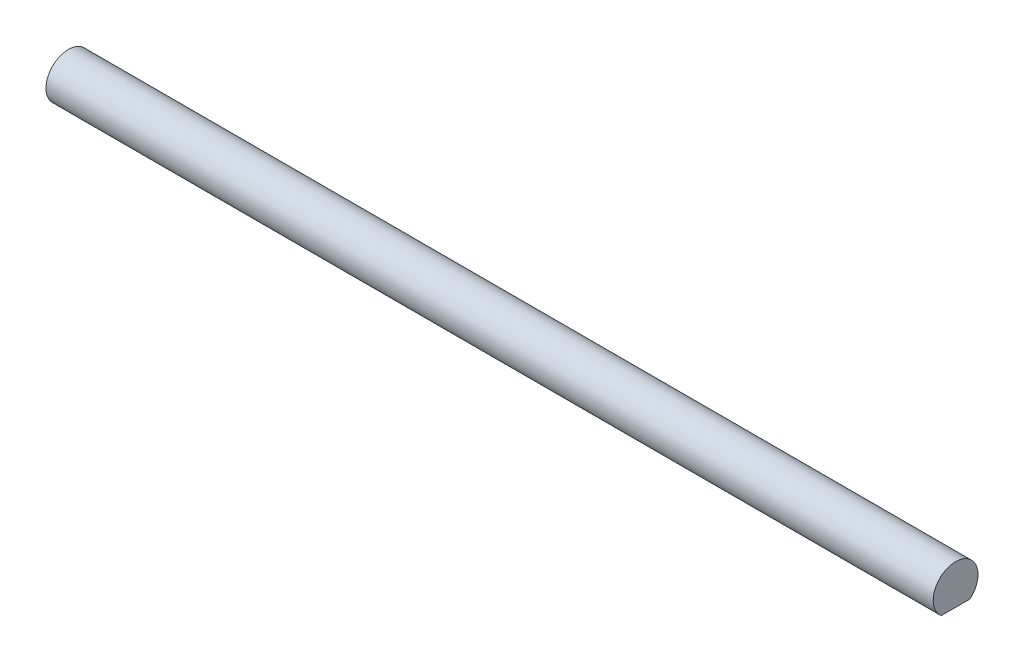
ISO-10303-21;
HEADER;
FILE_DESCRIPTION(('STEP AP214'),'2;1');
FILE_NAME('part.step','',(''),(''),'','','');
FILE_SCHEMA(('AUTOMOTIVE_DESIGN { 1 0 10303 214 1 1 1 1 }'));
ENDSEC;
DATA;
#1=APPLICATION_CONTEXT('core data for automotive mechanical design processes');
#2=APPLICATION_PROTOCOL_DEFINITION('international standard','automotive_design',2000,#1);
#3=PRODUCT_CONTEXT('',#1,'mechanical');
#4=PRODUCT('Part','Part','',(#3));
#5=PRODUCT_RELATED_PRODUCT_CATEGORY('part','',(#4));
#6=PRODUCT_DEFINITION_FORMATION('','',#4);
#7=PRODUCT_DEFINITION_CONTEXT('part definition',#1,'design');
#8=PRODUCT_DEFINITION('design','',#6,#7);
#9=PRODUCT_DEFINITION_SHAPE('','',#8);
#10=(LENGTH_UNIT() NAMED_UNIT(*) SI_UNIT(.MILLI.,.METRE.));
#11=(NAMED_UNIT(*) PLANE_ANGLE_UNIT() SI_UNIT($,.RADIAN.));
#12=(NAMED_UNIT(*) SI_UNIT($,.STERADIAN.) SOLID_ANGLE_UNIT());
#13=UNCERTAINTY_MEASURE_WITH_UNIT(LENGTH_MEASURE(1.E-05),#10,'distance_accuracy_value','');
#14=(GEOMETRIC_REPRESENTATION_CONTEXT(3) GLOBAL_UNCERTAINTY_ASSIGNED_CONTEXT((#13)) GLOBAL_UNIT_ASSIGNED_CONTEXT((#10,
#11,#12)) REPRESENTATION_CONTEXT('',''));
#15=CARTESIAN_POINT('',(0.,0.,0.));
#16=DIRECTION('',(0.,0.,1.));
#17=DIRECTION('',(1.,0.,0.));
#18=AXIS2_PLACEMENT_3D('',#15,#16,#17);
#19=CARTESIAN_POINT('',(304.8,-2.43959033446192,0.));
#20=DIRECTION('',(0.,1.,0.));
#21=DIRECTION('',(0.,0.,1.));
#22=AXIS2_PLACEMENT_3D('',#19,#20,#21);
#23=PLANE('',#22);
#24=DIRECTION('',(0.,0.,-1.));
#25=VECTOR('',#24,1.);
#26=CARTESIAN_POINT('',(125.73,-2.43959033446192,0.));
#27=LINE('',#26,#25);
#28=CARTESIAN_POINT('',(125.73,-2.43959033446192,2.032));
#29=VERTEX_POINT('',#28);
#30=CARTESIAN_POINT('',(125.73,-2.43959033446192,-2.032));
#31=VERTEX_POINT('',#30);
#32=EDGE_CURVE('E55',#29,#31,#27,.T.);
#33=ORIENTED_EDGE('',*,*,#32,.F.);
#34=DIRECTION('',(-1.,0.,0.));
#35=VECTOR('',#34,1.);
#36=CARTESIAN_POINT('',(304.8,-2.43959033446192,2.032));
#37=LINE('',#36,#35);
#38=CARTESIAN_POINT('',(0.,-2.43959033446192,2.032));
#39=VERTEX_POINT('',#38);
#40=EDGE_CURVE('E49',#29,#39,#37,.T.);
#41=ORIENTED_EDGE('',*,*,#40,.T.);
#42=DIRECTION('',(0.,0.,-1.));
#43=VECTOR('',#42,1.);
#44=CARTESIAN_POINT('',(0.,-2.43959033446192,0.));
#45=LINE('',#44,#43);
#46=CARTESIAN_POINT('',(0.,-2.43959033446192,-2.032));
#47=VERTEX_POINT('',#46);
#48=EDGE_CURVE('E73',#39,#47,#45,.T.);
#49=ORIENTED_EDGE('',*,*,#48,.T.);
#50=DIRECTION('',(-1.,0.,0.));
#51=VECTOR('',#50,1.);
#52=CARTESIAN_POINT('',(304.8,-2.43959033446192,-2.032));
#53=LINE('',#52,#51);
#54=EDGE_CURVE('E11',#31,#47,#53,.T.);
#55=ORIENTED_EDGE('',*,*,#54,.F.);
#56=EDGE_LOOP('',(#33,#41,#49,#55));
#57=FACE_BOUND('',#56,.T.);
#58=ADVANCED_FACE('F41',(#57),#23,.F.);
#59=CARTESIAN_POINT('',(304.8,0.,0.));
#60=DIRECTION('',(-1.,0.,0.));
#61=DIRECTION('',(0.,0.,1.));
#62=AXIS2_PLACEMENT_3D('',#59,#60,#61);
#63=CYLINDRICAL_SURFACE('',#62,3.175);
#64=CARTESIAN_POINT('',(125.73,0.,0.));
#65=DIRECTION('',(1.,0.,0.));
#66=DIRECTION('',(0.,0.,-1.));
#67=AXIS2_PLACEMENT_3D('',#64,#65,#66);
#68=CIRCLE('',#67,3.175);
#69=EDGE_CURVE('E66',#31,#29,#68,.T.);
#70=ORIENTED_EDGE('',*,*,#69,.F.);
#71=ORIENTED_EDGE('',*,*,#54,.T.);
#72=CARTESIAN_POINT('',(0.,0.,0.));
#73=DIRECTION('',(1.,0.,0.));
#74=DIRECTION('',(0.,0.,-1.));
#75=AXIS2_PLACEMENT_3D('',#72,#73,#74);
#76=CIRCLE('',#75,3.175);
#77=EDGE_CURVE('E77',#47,#39,#76,.T.);
#78=ORIENTED_EDGE('',*,*,#77,.T.);
#79=ORIENTED_EDGE('',*,*,#40,.F.);
#80=EDGE_LOOP('',(#70,#71,#78,#79));
#81=FACE_BOUND('',#80,.T.);
#82=ADVANCED_FACE('F75',(#81),#63,.T.);
#83=CARTESIAN_POINT('',(0.,0.,0.));
#84=DIRECTION('',(1.,0.,0.));
#85=DIRECTION('',(0.,0.,-1.));
#86=AXIS2_PLACEMENT_3D('',#83,#84,#85);
#87=PLANE('',#86);
#88=ORIENTED_EDGE('',*,*,#48,.F.);
#89=ORIENTED_EDGE('',*,*,#77,.F.);
#90=EDGE_LOOP('',(#88,#89));
#91=FACE_BOUND('',#90,.T.);
#92=ADVANCED_FACE('F85',(#91),#87,.F.);
#93=CARTESIAN_POINT('',(125.73,0.,0.));
#94=DIRECTION('',(1.,0.,0.));
#95=DIRECTION('',(0.,0.,-1.));
#96=AXIS2_PLACEMENT_3D('',#93,#94,#95);
#97=PLANE('',#96);
#98=ORIENTED_EDGE('',*,*,#32,.T.);
#99=ORIENTED_EDGE('',*,*,#69,.T.);
#100=EDGE_LOOP('',(#98,#99));
#101=FACE_BOUND('',#100,.T.);
#102=ADVANCED_FACE('F67',(#101),#97,.T.);
#103=CLOSED_SHELL('',(#58,#82,#92,#102));
#104=MANIFOLD_SOLID_BREP('B2',#103);
#105=ADVANCED_BREP_SHAPE_REPRESENTATION('',(#18,#104),#14);
#106=SHAPE_DEFINITION_REPRESENTATION(#9,#105);
ENDSEC;
END-ISO-10303-21;
